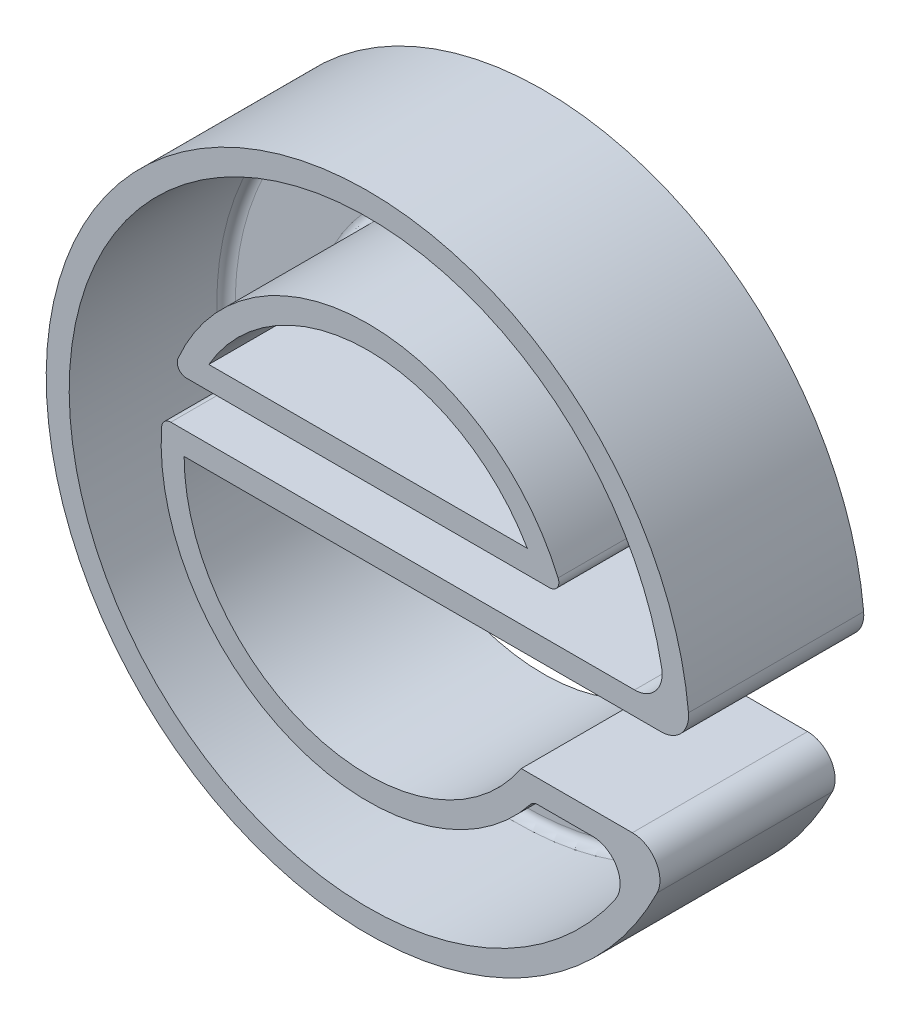
ISO-10303-21;
HEADER;
FILE_DESCRIPTION(('STEP AP214'),'2;1');
FILE_NAME('part.step','',(''),(''),'','','');
FILE_SCHEMA(('AUTOMOTIVE_DESIGN { 1 0 10303 214 1 1 1 1 }'));
ENDSEC;
DATA;
#1=APPLICATION_CONTEXT('core data for automotive mechanical design processes');
#2=APPLICATION_PROTOCOL_DEFINITION('international standard','automotive_design',2000,#1);
#3=PRODUCT_CONTEXT('',#1,'mechanical');
#4=PRODUCT('Part','Part','',(#3));
#5=PRODUCT_RELATED_PRODUCT_CATEGORY('part','',(#4));
#6=PRODUCT_DEFINITION_FORMATION('','',#4);
#7=PRODUCT_DEFINITION_CONTEXT('part definition',#1,'design');
#8=PRODUCT_DEFINITION('design','',#6,#7);
#9=PRODUCT_DEFINITION_SHAPE('','',#8);
#10=(LENGTH_UNIT() NAMED_UNIT(*) SI_UNIT(.MILLI.,.METRE.));
#11=(NAMED_UNIT(*) PLANE_ANGLE_UNIT() SI_UNIT($,.RADIAN.));
#12=(NAMED_UNIT(*) SI_UNIT($,.STERADIAN.) SOLID_ANGLE_UNIT());
#13=UNCERTAINTY_MEASURE_WITH_UNIT(LENGTH_MEASURE(1.E-05),#10,'distance_accuracy_value','');
#14=(GEOMETRIC_REPRESENTATION_CONTEXT(3) GLOBAL_UNCERTAINTY_ASSIGNED_CONTEXT((#13)) GLOBAL_UNIT_ASSIGNED_CONTEXT((#10,
#11,#12)) REPRESENTATION_CONTEXT('',''));
#15=CARTESIAN_POINT('',(0.,0.,0.));
#16=DIRECTION('',(0.,0.,1.));
#17=DIRECTION('',(1.,0.,0.));
#18=AXIS2_PLACEMENT_3D('',#15,#16,#17);
#19=CARTESIAN_POINT('',(0.,0.,19.05));
#20=DIRECTION('',(0.,0.,1.));
#21=DIRECTION('',(1.,0.,0.));
#22=AXIS2_PLACEMENT_3D('',#19,#20,#21);
#23=PLANE('',#22);
#24=DIRECTION('',(1.,0.,0.));
#25=VECTOR('',#24,1.);
#26=CARTESIAN_POINT('',(-17.3205080756888,10.,19.05));
#27=LINE('',#26,#25);
#28=CARTESIAN_POINT('',(-17.3205080756888,10.,19.05));
#29=VERTEX_POINT('',#28);
#30=CARTESIAN_POINT('',(17.3205080756888,10.,19.05));
#31=VERTEX_POINT('',#30);
#32=EDGE_CURVE('E216',#29,#31,#27,.T.);
#33=ORIENTED_EDGE('',*,*,#32,.F.);
#34=CARTESIAN_POINT('',(0.,0.,19.05));
#35=DIRECTION('',(0.,0.,1.));
#36=DIRECTION('',(1.,0.,0.));
#37=AXIS2_PLACEMENT_3D('',#34,#35,#36);
#38=CIRCLE('',#37,20.);
#39=EDGE_CURVE('E227',#31,#29,#38,.T.);
#40=ORIENTED_EDGE('',*,*,#39,.F.);
#41=EDGE_LOOP('',(#33,#40));
#42=FACE_BOUND('',#41,.T.);
#43=DIRECTION('',(1.,0.,0.));
#44=VECTOR('',#43,1.);
#45=CARTESIAN_POINT('',(21.2132034355964,7.50000000000001,19.05));
#46=LINE('',#45,#44);
#47=CARTESIAN_POINT('',(-19.7484176581315,7.5,19.05));
#48=VERTEX_POINT('',#47);
#49=CARTESIAN_POINT('',(19.7484176581315,7.50000000000001,19.05));
#50=VERTEX_POINT('',#49);
#51=EDGE_CURVE('E515',#48,#50,#46,.T.);
#52=ORIENTED_EDGE('',*,*,#51,.T.);
#53=CARTESIAN_POINT('',(19.7484176581315,8.5,19.05));
#54=DIRECTION('',(0.,0.,1.));
#55=DIRECTION('',(1.,0.,0.));
#56=AXIS2_PLACEMENT_3D('',#53,#54,#55);
#57=CIRCLE('',#56,1.);
#58=CARTESIAN_POINT('',(20.6669487119981,8.89534883720931,19.05));
#59=VERTEX_POINT('',#58);
#60=EDGE_CURVE('E422',#50,#59,#57,.T.);
#61=ORIENTED_EDGE('',*,*,#60,.T.);
#62=CARTESIAN_POINT('',(0.,0.,19.05));
#63=DIRECTION('',(0.,0.,1.));
#64=DIRECTION('',(1.,0.,0.));
#65=AXIS2_PLACEMENT_3D('',#62,#63,#64);
#66=CIRCLE('',#65,22.5);
#67=CARTESIAN_POINT('',(-20.6669487119981,8.8953488372093,19.05));
#68=VERTEX_POINT('',#67);
#69=EDGE_CURVE('E449',#59,#68,#66,.T.);
#70=ORIENTED_EDGE('',*,*,#69,.T.);
#71=CARTESIAN_POINT('',(-19.7484176581315,8.5,19.05));
#72=DIRECTION('',(0.,0.,1.));
#73=DIRECTION('',(1.,0.,0.));
#74=AXIS2_PLACEMENT_3D('',#71,#72,#73);
#75=CIRCLE('',#74,1.);
#76=EDGE_CURVE('E419',#68,#48,#75,.T.);
#77=ORIENTED_EDGE('',*,*,#76,.T.);
#78=EDGE_LOOP('',(#52,#61,#70,#77));
#79=FACE_BOUND('',#78,.T.);
#80=ADVANCED_FACE('F45',(#42,#79),#23,.T.);
#81=DIRECTION('',(1.,0.,0.));
#82=VECTOR('',#81,1.);
#83=CARTESIAN_POINT('',(20.,2.5,19.05));
#84=LINE('',#83,#82);
#85=CARTESIAN_POINT('',(-21.4476105895272,2.50000000000001,19.05));
#86=VERTEX_POINT('',#85);
#87=CARTESIAN_POINT('',(28.9827534923789,2.5,19.05));
#88=VERTEX_POINT('',#87);
#89=EDGE_CURVE('E242',#86,#88,#84,.T.);
#90=ORIENTED_EDGE('',*,*,#89,.F.);
#91=CARTESIAN_POINT('',(-21.4476105895272,1.50000000000001,19.05));
#92=DIRECTION('',(0.,0.,1.));
#93=DIRECTION('',(1.,0.,0.));
#94=AXIS2_PLACEMENT_3D('',#91,#92,#93);
#95=CIRCLE('',#94,1.);
#96=CARTESIAN_POINT('',(-22.445173872761,1.56976744186048,19.05));
#97=VERTEX_POINT('',#96);
#98=EDGE_CURVE('E55',#86,#97,#95,.T.);
#99=ORIENTED_EDGE('',*,*,#98,.T.);
#100=CARTESIAN_POINT('',(0.,0.,19.05));
#101=DIRECTION('',(0.,0.,-1.));
#102=DIRECTION('',(1.,0.,0.));
#103=AXIS2_PLACEMENT_3D('',#100,#101,#102);
#104=CIRCLE('',#103,22.5);
#105=CARTESIAN_POINT('',(17.6553113772267,-13.9477589659834,19.05));
#106=VERTEX_POINT('',#105);
#107=EDGE_CURVE('E497',#106,#97,#104,.T.);
#108=ORIENTED_EDGE('',*,*,#107,.F.);
#109=CARTESIAN_POINT('',(18.4399918828812,-14.5676593644715,19.05));
#110=DIRECTION('',(0.,0.,1.));
#111=DIRECTION('',(1.,0.,0.));
#112=AXIS2_PLACEMENT_3D('',#109,#110,#111);
#113=CIRCLE('',#112,1.);
#114=CARTESIAN_POINT('',(18.4399918828812,-13.5676593644715,19.05));
#115=VERTEX_POINT('',#114);
#116=EDGE_CURVE('E11',#106,#115,#113,.F.);
#117=ORIENTED_EDGE('',*,*,#116,.T.);
#118=DIRECTION('',(-1.,0.,0.));
#119=VECTOR('',#118,1.);
#120=CARTESIAN_POINT('',(29.5325010686475,-13.5676593644715,19.05));
#121=LINE('',#120,#119);
#122=CARTESIAN_POINT('',(24.4082499000407,-13.5676593644715,19.05));
#123=VERTEX_POINT('',#122);
#124=EDGE_CURVE('E506',#123,#115,#121,.T.);
#125=ORIENTED_EDGE('',*,*,#124,.F.);
#126=CARTESIAN_POINT('',(24.4082499000407,-16.5676593644715,19.05));
#127=DIRECTION('',(0.,0.,1.));
#128=DIRECTION('',(1.,0.,0.));
#129=AXIS2_PLACEMENT_3D('',#126,#127,#128);
#130=CIRCLE('',#129,3.);
#131=CARTESIAN_POINT('',(26.8904448051296,-18.2525060795025,19.05));
#132=VERTEX_POINT('',#131);
#133=EDGE_CURVE('E330',#123,#132,#130,.F.);
#134=ORIENTED_EDGE('',*,*,#133,.T.);
#135=CARTESIAN_POINT('',(0.,0.,19.05));
#136=DIRECTION('',(0.,0.,1.));
#137=DIRECTION('',(1.,0.,0.));
#138=AXIS2_PLACEMENT_3D('',#135,#136,#137);
#139=CIRCLE('',#138,32.5);
#140=CARTESIAN_POINT('',(31.9301521526208,6.05932203389831,19.05));
#141=VERTEX_POINT('',#140);
#142=EDGE_CURVE('E509',#141,#132,#139,.T.);
#143=ORIENTED_EDGE('',*,*,#142,.F.);
#144=CARTESIAN_POINT('',(28.9827534923789,5.5,19.05));
#145=DIRECTION('',(0.,0.,1.));
#146=DIRECTION('',(1.,0.,0.));
#147=AXIS2_PLACEMENT_3D('',#144,#145,#146);
#148=CIRCLE('',#147,3.);
#149=EDGE_CURVE('E326',#141,#88,#148,.F.);
#150=ORIENTED_EDGE('',*,*,#149,.T.);
#151=EDGE_LOOP('',(#90,#99,#108,#117,#125,#134,#143,#150));
#152=FACE_BOUND('',#151,.T.);
#153=DIRECTION('',(1.,0.,0.));
#154=VECTOR('',#153,1.);
#155=CARTESIAN_POINT('',(-20.,0.,19.05));
#156=LINE('',#155,#154);
#157=CARTESIAN_POINT('',(-20.,0.,19.05));
#158=VERTEX_POINT('',#157);
#159=CARTESIAN_POINT('',(31.859064644148,0.,19.05));
#160=VERTEX_POINT('',#159);
#161=EDGE_CURVE('E250',#158,#160,#156,.T.);
#162=ORIENTED_EDGE('',*,*,#161,.T.);
#163=CARTESIAN_POINT('',(31.859064644148,3.,19.05));
#164=DIRECTION('',(0.,0.,1.));
#165=DIRECTION('',(1.,0.,0.));
#166=AXIS2_PLACEMENT_3D('',#163,#164,#165);
#167=CIRCLE('',#166,3.);
#168=CARTESIAN_POINT('',(34.8458519545369,3.28125,19.05));
#169=VERTEX_POINT('',#168);
#170=EDGE_CURVE('E316',#160,#169,#167,.T.);
#171=ORIENTED_EDGE('',*,*,#170,.T.);
#172=CARTESIAN_POINT('',(0.,0.,19.05));
#173=DIRECTION('',(0.,0.,1.));
#174=DIRECTION('',(1.,0.,0.));
#175=AXIS2_PLACEMENT_3D('',#172,#173,#174);
#176=CIRCLE('',#175,35.);
#177=CARTESIAN_POINT('',(31.4365319807222,-15.3865024298907,19.05));
#178=VERTEX_POINT('',#177);
#179=EDGE_CURVE('E254',#169,#178,#176,.T.);
#180=ORIENTED_EDGE('',*,*,#179,.T.);
#181=CARTESIAN_POINT('',(28.7419720966603,-14.0676593644715,19.05));
#182=DIRECTION('',(0.,0.,1.));
#183=DIRECTION('',(1.,0.,0.));
#184=AXIS2_PLACEMENT_3D('',#181,#182,#183);
#185=CIRCLE('',#184,3.);
#186=CARTESIAN_POINT('',(28.7419720966603,-11.0676593644715,19.05));
#187=VERTEX_POINT('',#186);
#188=EDGE_CURVE('E313',#178,#187,#185,.T.);
#189=ORIENTED_EDGE('',*,*,#188,.T.);
#190=DIRECTION('',(-1.,0.,0.));
#191=VECTOR('',#190,1.);
#192=CARTESIAN_POINT('',(16.6585388372458,-11.0676593644715,19.05));
#193=LINE('',#192,#191);
#194=CARTESIAN_POINT('',(16.6585388372458,-11.0676593644715,19.05));
#195=VERTEX_POINT('',#194);
#196=EDGE_CURVE('E259',#187,#195,#193,.T.);
#197=ORIENTED_EDGE('',*,*,#196,.T.);
#198=CARTESIAN_POINT('',(0.,0.,19.05));
#199=DIRECTION('',(0.,0.,-1.));
#200=DIRECTION('',(1.,0.,0.));
#201=AXIS2_PLACEMENT_3D('',#198,#199,#200);
#202=CIRCLE('',#201,20.);
#203=EDGE_CURVE('E262',#195,#158,#202,.T.);
#204=ORIENTED_EDGE('',*,*,#203,.T.);
#205=EDGE_LOOP('',(#162,#171,#180,#189,#197,#204));
#206=FACE_BOUND('',#205,.T.);
#207=ADVANCED_FACE('F500',(#152,#206),#23,.T.);
#208=CARTESIAN_POINT('',(0.,0.,0.));
#209=DIRECTION('',(0.,0.,1.));
#210=DIRECTION('',(1.,0.,0.));
#211=AXIS2_PLACEMENT_3D('',#208,#209,#210);
#212=PLANE('',#211);
#213=CARTESIAN_POINT('',(0.,0.,0.));
#214=DIRECTION('',(0.,0.,1.));
#215=DIRECTION('',(1.,0.,0.));
#216=AXIS2_PLACEMENT_3D('',#213,#214,#215);
#217=CIRCLE('',#216,35.);
#218=CARTESIAN_POINT('',(34.8458519545369,3.28125,0.));
#219=VERTEX_POINT('',#218);
#220=CARTESIAN_POINT('',(31.4365319807222,-15.3865024298907,0.));
#221=VERTEX_POINT('',#220);
#222=EDGE_CURVE('E269',#219,#221,#217,.T.);
#223=ORIENTED_EDGE('',*,*,#222,.F.);
#224=CARTESIAN_POINT('',(31.859064644148,3.,0.));
#225=DIRECTION('',(0.,0.,1.));
#226=DIRECTION('',(1.,0.,0.));
#227=AXIS2_PLACEMENT_3D('',#224,#225,#226);
#228=CIRCLE('',#227,3.);
#229=CARTESIAN_POINT('',(31.859064644148,0.,0.));
#230=VERTEX_POINT('',#229);
#231=EDGE_CURVE('E307',#219,#230,#228,.F.);
#232=ORIENTED_EDGE('',*,*,#231,.T.);
#233=DIRECTION('',(1.,0.,0.));
#234=VECTOR('',#233,1.);
#235=CARTESIAN_POINT('',(0.,0.,0.));
#236=LINE('',#235,#234);
#237=CARTESIAN_POINT('',(-20.,0.,0.));
#238=VERTEX_POINT('',#237);
#239=EDGE_CURVE('E249',#238,#230,#236,.T.);
#240=ORIENTED_EDGE('',*,*,#239,.F.);
#241=CARTESIAN_POINT('',(0.,0.,0.));
#242=DIRECTION('',(0.,0.,-1.));
#243=DIRECTION('',(1.,0.,0.));
#244=AXIS2_PLACEMENT_3D('',#241,#242,#243);
#245=CIRCLE('',#244,20.);
#246=CARTESIAN_POINT('',(16.6585388372458,-11.0676593644715,0.));
#247=VERTEX_POINT('',#246);
#248=EDGE_CURVE('E255',#247,#238,#245,.T.);
#249=ORIENTED_EDGE('',*,*,#248,.F.);
#250=DIRECTION('',(-1.,0.,0.));
#251=VECTOR('',#250,1.);
#252=CARTESIAN_POINT('',(16.6585388372458,-11.0676593644715,0.));
#253=LINE('',#252,#251);
#254=CARTESIAN_POINT('',(28.7419720966603,-11.0676593644715,0.));
#255=VERTEX_POINT('',#254);
#256=EDGE_CURVE('E273',#255,#247,#253,.T.);
#257=ORIENTED_EDGE('',*,*,#256,.F.);
#258=CARTESIAN_POINT('',(28.7419720966603,-14.0676593644715,0.));
#259=DIRECTION('',(0.,0.,1.));
#260=DIRECTION('',(1.,0.,0.));
#261=AXIS2_PLACEMENT_3D('',#258,#259,#260);
#262=CIRCLE('',#261,3.);
#263=EDGE_CURVE('E304',#255,#221,#262,.F.);
#264=ORIENTED_EDGE('',*,*,#263,.T.);
#265=EDGE_LOOP('',(#223,#232,#240,#249,#257,#264));
#266=FACE_BOUND('',#265,.T.);
#267=CARTESIAN_POINT('',(0.,0.,0.));
#268=DIRECTION('',(0.,0.,1.));
#269=DIRECTION('',(1.,0.,0.));
#270=AXIS2_PLACEMENT_3D('',#267,#268,#269);
#271=CIRCLE('',#270,20.);
#272=CARTESIAN_POINT('',(17.3205080756888,10.,0.));
#273=VERTEX_POINT('',#272);
#274=CARTESIAN_POINT('',(-17.3205080756888,10.,0.));
#275=VERTEX_POINT('',#274);
#276=EDGE_CURVE('E232',#273,#275,#271,.T.);
#277=ORIENTED_EDGE('',*,*,#276,.T.);
#278=DIRECTION('',(1.,0.,0.));
#279=VECTOR('',#278,1.);
#280=CARTESIAN_POINT('',(-17.3205080756888,10.,0.));
#281=LINE('',#280,#279);
#282=EDGE_CURVE('E237',#275,#273,#281,.T.);
#283=ORIENTED_EDGE('',*,*,#282,.T.);
#284=EDGE_LOOP('',(#277,#283));
#285=FACE_BOUND('',#284,.T.);
#286=ADVANCED_FACE('F607',(#266,#285),#212,.F.);
#287=CARTESIAN_POINT('',(0.,0.,19.05));
#288=DIRECTION('',(0.,1.,0.));
#289=DIRECTION('',(0.,0.,1.));
#290=AXIS2_PLACEMENT_3D('',#287,#288,#289);
#291=PLANE('',#290);
#292=ORIENTED_EDGE('',*,*,#239,.T.);
#293=DIRECTION('',(0.,0.,-1.));
#294=VECTOR('',#293,1.);
#295=CARTESIAN_POINT('',(31.859064644148,0.,19.05));
#296=LINE('',#295,#294);
#297=EDGE_CURVE('E310',#230,#160,#296,.F.);
#298=ORIENTED_EDGE('',*,*,#297,.T.);
#299=ORIENTED_EDGE('',*,*,#161,.F.);
#300=DIRECTION('',(0.,0.,-1.));
#301=VECTOR('',#300,1.);
#302=CARTESIAN_POINT('',(-20.,0.,19.05));
#303=LINE('',#302,#301);
#304=EDGE_CURVE('E265',#158,#238,#303,.T.);
#305=ORIENTED_EDGE('',*,*,#304,.T.);
#306=EDGE_LOOP('',(#292,#298,#299,#305));
#307=FACE_BOUND('',#306,.T.);
#308=ADVANCED_FACE('F613',(#307),#291,.F.);
#309=CARTESIAN_POINT('',(0.,0.,19.05));
#310=DIRECTION('',(0.,0.,-1.));
#311=DIRECTION('',(-1.,0.,0.));
#312=AXIS2_PLACEMENT_3D('',#309,#310,#311);
#313=CYLINDRICAL_SURFACE('',#312,35.);
#314=ORIENTED_EDGE('',*,*,#179,.F.);
#315=DIRECTION('',(0.,0.,-1.));
#316=VECTOR('',#315,1.);
#317=CARTESIAN_POINT('',(34.8458519545369,3.28125,19.05));
#318=LINE('',#317,#316);
#319=EDGE_CURVE('E300',#169,#219,#318,.T.);
#320=ORIENTED_EDGE('',*,*,#319,.T.);
#321=ORIENTED_EDGE('',*,*,#222,.T.);
#322=DIRECTION('',(0.,0.,-1.));
#323=VECTOR('',#322,1.);
#324=CARTESIAN_POINT('',(31.4365319807222,-15.3865024298907,19.05));
#325=LINE('',#324,#323);
#326=EDGE_CURVE('E297',#221,#178,#325,.F.);
#327=ORIENTED_EDGE('',*,*,#326,.T.);
#328=EDGE_LOOP('',(#314,#320,#321,#327));
#329=FACE_BOUND('',#328,.T.);
#330=ADVANCED_FACE('F622',(#329),#313,.T.);
#331=CARTESIAN_POINT('',(16.6585388372458,-11.0676593644715,19.05));
#332=DIRECTION('',(0.,-1.,0.));
#333=DIRECTION('',(1.,0.,0.));
#334=AXIS2_PLACEMENT_3D('',#331,#332,#333);
#335=PLANE('',#334);
#336=ORIENTED_EDGE('',*,*,#196,.F.);
#337=DIRECTION('',(0.,0.,-1.));
#338=VECTOR('',#337,1.);
#339=CARTESIAN_POINT('',(28.7419720966603,-11.0676593644715,19.05));
#340=LINE('',#339,#338);
#341=EDGE_CURVE('E319',#187,#255,#340,.T.);
#342=ORIENTED_EDGE('',*,*,#341,.T.);
#343=ORIENTED_EDGE('',*,*,#256,.T.);
#344=DIRECTION('',(0.,0.,-1.));
#345=VECTOR('',#344,1.);
#346=CARTESIAN_POINT('',(16.6585388372458,-11.0676593644715,19.05));
#347=LINE('',#346,#345);
#348=EDGE_CURVE('E282',#195,#247,#347,.T.);
#349=ORIENTED_EDGE('',*,*,#348,.F.);
#350=EDGE_LOOP('',(#336,#342,#343,#349));
#351=FACE_BOUND('',#350,.T.);
#352=ADVANCED_FACE('F618',(#351),#335,.F.);
#353=CARTESIAN_POINT('',(0.,0.,19.05));
#354=DIRECTION('',(0.,0.,-1.));
#355=DIRECTION('',(-1.,0.,0.));
#356=AXIS2_PLACEMENT_3D('',#353,#354,#355);
#357=CYLINDRICAL_SURFACE('',#356,20.);
#358=ORIENTED_EDGE('',*,*,#248,.T.);
#359=ORIENTED_EDGE('',*,*,#304,.F.);
#360=ORIENTED_EDGE('',*,*,#203,.F.);
#361=ORIENTED_EDGE('',*,*,#348,.T.);
#362=EDGE_LOOP('',(#358,#359,#360,#361));
#363=FACE_BOUND('',#362,.T.);
#364=ADVANCED_FACE('F615',(#363),#357,.F.);
#365=CARTESIAN_POINT('',(0.,0.,19.05));
#366=DIRECTION('',(0.,0.,-1.));
#367=DIRECTION('',(-1.,0.,0.));
#368=AXIS2_PLACEMENT_3D('',#365,#366,#367);
#369=CYLINDRICAL_SURFACE('',#368,20.);
#370=ORIENTED_EDGE('',*,*,#276,.F.);
#371=DIRECTION('',(0.,0.,-1.));
#372=VECTOR('',#371,1.);
#373=CARTESIAN_POINT('',(17.3205080756888,10.,19.05));
#374=LINE('',#373,#372);
#375=EDGE_CURVE('E219',#31,#273,#374,.T.);
#376=ORIENTED_EDGE('',*,*,#375,.F.);
#377=ORIENTED_EDGE('',*,*,#39,.T.);
#378=DIRECTION('',(0.,0.,-1.));
#379=VECTOR('',#378,1.);
#380=CARTESIAN_POINT('',(-17.3205080756888,10.,19.05));
#381=LINE('',#380,#379);
#382=EDGE_CURVE('E222',#29,#275,#381,.T.);
#383=ORIENTED_EDGE('',*,*,#382,.T.);
#384=EDGE_LOOP('',(#370,#376,#377,#383));
#385=FACE_BOUND('',#384,.T.);
#386=ADVANCED_FACE('F230',(#385),#369,.F.);
#387=CARTESIAN_POINT('',(-17.3205080756888,10.,19.05));
#388=DIRECTION('',(0.,1.,0.));
#389=DIRECTION('',(0.,0.,1.));
#390=AXIS2_PLACEMENT_3D('',#387,#388,#389);
#391=PLANE('',#390);
#392=ORIENTED_EDGE('',*,*,#282,.F.);
#393=ORIENTED_EDGE('',*,*,#382,.F.);
#394=ORIENTED_EDGE('',*,*,#32,.T.);
#395=ORIENTED_EDGE('',*,*,#375,.T.);
#396=EDGE_LOOP('',(#392,#393,#394,#395));
#397=FACE_BOUND('',#396,.T.);
#398=ADVANCED_FACE('F218',(#397),#391,.T.);
#399=CARTESIAN_POINT('',(0.,0.,2.));
#400=DIRECTION('',(0.,0.,1.));
#401=DIRECTION('',(1.,0.,0.));
#402=AXIS2_PLACEMENT_3D('',#399,#400,#401);
#403=CYLINDRICAL_SURFACE('',#402,32.5);
#404=DIRECTION('',(0.,0.,1.));
#405=VECTOR('',#404,1.);
#406=CARTESIAN_POINT('',(26.8904448051296,-18.2525060795025,2.));
#407=LINE('',#406,#405);
#408=CARTESIAN_POINT('',(26.8904448051296,-18.2525060795025,3.));
#409=VERTEX_POINT('',#408);
#410=EDGE_CURVE('E286',#132,#409,#407,.F.);
#411=ORIENTED_EDGE('',*,*,#410,.T.);
#412=CARTESIAN_POINT('',(0.,0.,3.));
#413=DIRECTION('',(0.,0.,1.));
#414=DIRECTION('',(1.,0.,0.));
#415=AXIS2_PLACEMENT_3D('',#412,#413,#414);
#416=CIRCLE('',#415,32.5);
#417=CARTESIAN_POINT('',(31.9301521526208,6.05932203389831,3.));
#418=VERTEX_POINT('',#417);
#419=EDGE_CURVE('E416',#409,#418,#416,.F.);
#420=ORIENTED_EDGE('',*,*,#419,.T.);
#421=DIRECTION('',(0.,0.,1.));
#422=VECTOR('',#421,1.);
#423=CARTESIAN_POINT('',(31.9301521526208,6.05932203389831,2.));
#424=LINE('',#423,#422);
#425=EDGE_CURVE('E290',#418,#141,#424,.T.);
#426=ORIENTED_EDGE('',*,*,#425,.T.);
#427=ORIENTED_EDGE('',*,*,#142,.T.);
#428=EDGE_LOOP('',(#411,#420,#426,#427));
#429=FACE_BOUND('',#428,.T.);
#430=ADVANCED_FACE('F576',(#429),#403,.F.);
#431=CARTESIAN_POINT('',(20.,2.5,2.));
#432=DIRECTION('',(0.,-1.,0.));
#433=DIRECTION('',(1.,0.,0.));
#434=AXIS2_PLACEMENT_3D('',#431,#432,#433);
#435=PLANE('',#434);
#436=DIRECTION('',(0.,0.,-1.));
#437=VECTOR('',#436,1.);
#438=CARTESIAN_POINT('',(28.9827534923789,2.5,2.));
#439=LINE('',#438,#437);
#440=CARTESIAN_POINT('',(28.9827534923789,2.5,3.));
#441=VERTEX_POINT('',#440);
#442=EDGE_CURVE('E293',#88,#441,#439,.T.);
#443=ORIENTED_EDGE('',*,*,#442,.T.);
#444=DIRECTION('',(1.,0.,0.));
#445=VECTOR('',#444,1.);
#446=CARTESIAN_POINT('',(20.,2.5,3.));
#447=LINE('',#446,#445);
#448=CARTESIAN_POINT('',(-21.4476105895272,2.50000000000001,3.));
#449=VERTEX_POINT('',#448);
#450=EDGE_CURVE('E400',#441,#449,#447,.F.);
#451=ORIENTED_EDGE('',*,*,#450,.T.);
#452=DIRECTION('',(0.,0.,1.));
#453=VECTOR('',#452,1.);
#454=CARTESIAN_POINT('',(-21.4476105895272,2.50000000000001,2.));
#455=LINE('',#454,#453);
#456=EDGE_CURVE('E397',#449,#86,#455,.T.);
#457=ORIENTED_EDGE('',*,*,#456,.T.);
#458=ORIENTED_EDGE('',*,*,#89,.T.);
#459=EDGE_LOOP('',(#443,#451,#457,#458));
#460=FACE_BOUND('',#459,.T.);
#461=ADVANCED_FACE('F861',(#460),#435,.F.);
#462=CARTESIAN_POINT('',(0.,0.,2.));
#463=DIRECTION('',(0.,0.,1.));
#464=DIRECTION('',(1.,0.,0.));
#465=AXIS2_PLACEMENT_3D('',#462,#463,#464);
#466=CYLINDRICAL_SURFACE('',#465,22.5);
#467=ORIENTED_EDGE('',*,*,#107,.T.);
#468=DIRECTION('',(0.,0.,1.));
#469=VECTOR('',#468,1.);
#470=CARTESIAN_POINT('',(-22.445173872761,1.56976744186048,2.));
#471=LINE('',#470,#469);
#472=CARTESIAN_POINT('',(-22.445173872761,1.56976744186048,3.));
#473=VERTEX_POINT('',#472);
#474=EDGE_CURVE('E63',#97,#473,#471,.F.);
#475=ORIENTED_EDGE('',*,*,#474,.T.);
#476=CARTESIAN_POINT('',(0.,0.,3.));
#477=DIRECTION('',(0.,0.,1.));
#478=DIRECTION('',(1.,0.,0.));
#479=AXIS2_PLACEMENT_3D('',#476,#477,#478);
#480=CIRCLE('',#479,22.5);
#481=CARTESIAN_POINT('',(17.6553113772267,-13.9477589659834,3.));
#482=VERTEX_POINT('',#481);
#483=EDGE_CURVE('E67',#473,#482,#480,.T.);
#484=ORIENTED_EDGE('',*,*,#483,.T.);
#485=DIRECTION('',(0.,0.,1.));
#486=VECTOR('',#485,1.);
#487=CARTESIAN_POINT('',(17.6553113772267,-13.9477589659834,2.));
#488=LINE('',#487,#486);
#489=EDGE_CURVE('E409',#482,#106,#488,.T.);
#490=ORIENTED_EDGE('',*,*,#489,.T.);
#491=EDGE_LOOP('',(#467,#475,#484,#490));
#492=FACE_BOUND('',#491,.T.);
#493=ADVANCED_FACE('F496',(#492),#466,.T.);
#494=CARTESIAN_POINT('',(29.5325010686475,-13.5676593644715,2.));
#495=DIRECTION('',(0.,1.,0.));
#496=DIRECTION('',(0.,0.,1.));
#497=AXIS2_PLACEMENT_3D('',#494,#495,#496);
#498=PLANE('',#497);
#499=DIRECTION('',(0.,0.,-1.));
#500=VECTOR('',#499,1.);
#501=CARTESIAN_POINT('',(18.4399918828812,-13.5676593644715,2.));
#502=LINE('',#501,#500);
#503=CARTESIAN_POINT('',(18.4399918828812,-13.5676593644715,3.));
#504=VERTEX_POINT('',#503);
#505=EDGE_CURVE('E403',#115,#504,#502,.T.);
#506=ORIENTED_EDGE('',*,*,#505,.T.);
#507=DIRECTION('',(-1.,0.,0.));
#508=VECTOR('',#507,1.);
#509=CARTESIAN_POINT('',(29.5325010686475,-13.5676593644715,3.));
#510=LINE('',#509,#508);
#511=CARTESIAN_POINT('',(24.4082499000407,-13.5676593644715,3.));
#512=VERTEX_POINT('',#511);
#513=EDGE_CURVE('E406',#504,#512,#510,.F.);
#514=ORIENTED_EDGE('',*,*,#513,.T.);
#515=DIRECTION('',(0.,0.,-1.));
#516=VECTOR('',#515,1.);
#517=CARTESIAN_POINT('',(24.4082499000407,-13.5676593644715,19.05));
#518=LINE('',#517,#516);
#519=EDGE_CURVE('E323',#512,#123,#518,.F.);
#520=ORIENTED_EDGE('',*,*,#519,.T.);
#521=ORIENTED_EDGE('',*,*,#124,.T.);
#522=EDGE_LOOP('',(#506,#514,#520,#521));
#523=FACE_BOUND('',#522,.T.);
#524=ADVANCED_FACE('F559',(#523),#498,.F.);
#525=CARTESIAN_POINT('',(0.,0.,2.));
#526=DIRECTION('',(0.,0.,1.));
#527=DIRECTION('',(1.,0.,0.));
#528=AXIS2_PLACEMENT_3D('',#525,#526,#527);
#529=PLANE('',#528);
#530=CARTESIAN_POINT('',(19.7484176581315,8.5,2.));
#531=DIRECTION('',(0.,0.,1.));
#532=DIRECTION('',(1.,0.,0.));
#533=AXIS2_PLACEMENT_3D('',#530,#531,#532);
#534=CIRCLE('',#533,2.);
#535=CARTESIAN_POINT('',(19.7484176581315,6.50000000000001,2.));
#536=VERTEX_POINT('',#535);
#537=CARTESIAN_POINT('',(21.5854797658647,9.29069767441861,2.));
#538=VERTEX_POINT('',#537);
#539=EDGE_CURVE('E366',#536,#538,#534,.T.);
#540=ORIENTED_EDGE('',*,*,#539,.F.);
#541=DIRECTION('',(1.,0.,0.));
#542=VECTOR('',#541,1.);
#543=CARTESIAN_POINT('',(-21.2132034355964,6.5,2.));
#544=LINE('',#543,#542);
#545=CARTESIAN_POINT('',(-19.7484176581315,6.5,2.));
#546=VERTEX_POINT('',#545);
#547=EDGE_CURVE('E377',#536,#546,#544,.F.);
#548=ORIENTED_EDGE('',*,*,#547,.T.);
#549=CARTESIAN_POINT('',(-19.7484176581315,8.5,2.));
#550=DIRECTION('',(0.,0.,1.));
#551=DIRECTION('',(1.,0.,0.));
#552=AXIS2_PLACEMENT_3D('',#549,#550,#551);
#553=CIRCLE('',#552,2.);
#554=CARTESIAN_POINT('',(-21.5854797658647,9.2906976744186,2.));
#555=VERTEX_POINT('',#554);
#556=EDGE_CURVE('E373',#555,#546,#553,.T.);
#557=ORIENTED_EDGE('',*,*,#556,.F.);
#558=CARTESIAN_POINT('',(0.,0.,2.));
#559=DIRECTION('',(0.,0.,1.));
#560=DIRECTION('',(1.,0.,0.));
#561=AXIS2_PLACEMENT_3D('',#558,#559,#560);
#562=CIRCLE('',#561,23.5);
#563=EDGE_CURVE('E370',#555,#538,#562,.F.);
#564=ORIENTED_EDGE('',*,*,#563,.T.);
#565=EDGE_LOOP('',(#540,#548,#557,#564));
#566=FACE_BOUND('',#565,.T.);
#567=DIRECTION('',(-1.,0.,0.));
#568=VECTOR('',#567,1.);
#569=CARTESIAN_POINT('',(0.,-14.5676593644715,2.));
#570=LINE('',#569,#568);
#571=CARTESIAN_POINT('',(24.4082499000407,-14.5676593644715,2.));
#572=VERTEX_POINT('',#571);
#573=CARTESIAN_POINT('',(18.4399918828812,-14.5676593644715,2.));
#574=VERTEX_POINT('',#573);
#575=EDGE_CURVE('E353',#572,#574,#570,.T.);
#576=ORIENTED_EDGE('',*,*,#575,.T.);
#577=CARTESIAN_POINT('',(0.,0.,2.));
#578=DIRECTION('',(0.,0.,1.));
#579=DIRECTION('',(1.,0.,0.));
#580=AXIS2_PLACEMENT_3D('',#577,#578,#579);
#581=CIRCLE('',#580,23.5);
#582=CARTESIAN_POINT('',(-23.4427371559949,1.63953488372094,2.));
#583=VERTEX_POINT('',#582);
#584=EDGE_CURVE('E363',#574,#583,#581,.F.);
#585=ORIENTED_EDGE('',*,*,#584,.T.);
#586=CARTESIAN_POINT('',(-21.4476105895272,1.50000000000001,2.));
#587=DIRECTION('',(0.,0.,1.));
#588=DIRECTION('',(1.,0.,0.));
#589=AXIS2_PLACEMENT_3D('',#586,#587,#588);
#590=CIRCLE('',#589,2.);
#591=CARTESIAN_POINT('',(-21.4476105895272,3.50000000000001,2.));
#592=VERTEX_POINT('',#591);
#593=EDGE_CURVE('E359',#592,#583,#590,.T.);
#594=ORIENTED_EDGE('',*,*,#593,.F.);
#595=DIRECTION('',(1.,0.,0.));
#596=VECTOR('',#595,1.);
#597=CARTESIAN_POINT('',(0.,3.50000000000001,2.));
#598=LINE('',#597,#596);
#599=CARTESIAN_POINT('',(28.9827534923789,3.5,2.));
#600=VERTEX_POINT('',#599);
#601=EDGE_CURVE('E356',#592,#600,#598,.T.);
#602=ORIENTED_EDGE('',*,*,#601,.T.);
#603=CARTESIAN_POINT('',(28.9827534923789,5.5,2.));
#604=DIRECTION('',(0.,0.,1.));
#605=DIRECTION('',(1.,0.,0.));
#606=AXIS2_PLACEMENT_3D('',#603,#604,#605);
#607=CIRCLE('',#606,2.);
#608=CARTESIAN_POINT('',(30.9476859325402,5.87288135593221,2.));
#609=VERTEX_POINT('',#608);
#610=EDGE_CURVE('E349',#600,#609,#607,.T.);
#611=ORIENTED_EDGE('',*,*,#610,.T.);
#612=CARTESIAN_POINT('',(0.,0.,2.));
#613=DIRECTION('',(0.,0.,1.));
#614=DIRECTION('',(1.,0.,0.));
#615=AXIS2_PLACEMENT_3D('',#612,#613,#614);
#616=CIRCLE('',#615,31.5);
#617=CARTESIAN_POINT('',(26.0630465034333,-17.6908905078255,2.));
#618=VERTEX_POINT('',#617);
#619=EDGE_CURVE('E343',#609,#618,#616,.T.);
#620=ORIENTED_EDGE('',*,*,#619,.T.);
#621=CARTESIAN_POINT('',(24.4082499000407,-16.5676593644715,2.));
#622=DIRECTION('',(0.,0.,1.));
#623=DIRECTION('',(1.,0.,0.));
#624=AXIS2_PLACEMENT_3D('',#621,#622,#623);
#625=CIRCLE('',#624,2.);
#626=EDGE_CURVE('E346',#618,#572,#625,.T.);
#627=ORIENTED_EDGE('',*,*,#626,.T.);
#628=EDGE_LOOP('',(#576,#585,#594,#602,#611,#620,#627));
#629=FACE_BOUND('',#628,.T.);
#630=ADVANCED_FACE('F556',(#566,#629),#529,.T.);
#631=CARTESIAN_POINT('',(0.,0.,2.));
#632=DIRECTION('',(0.,0.,1.));
#633=DIRECTION('',(1.,0.,0.));
#634=AXIS2_PLACEMENT_3D('',#631,#632,#633);
#635=CYLINDRICAL_SURFACE('',#634,22.5);
#636=ORIENTED_EDGE('',*,*,#69,.F.);
#637=DIRECTION('',(0.,0.,1.));
#638=VECTOR('',#637,1.);
#639=CARTESIAN_POINT('',(20.6669487119981,8.8953488372093,2.));
#640=LINE('',#639,#638);
#641=CARTESIAN_POINT('',(20.6669487119981,8.89534883720931,3.));
#642=VERTEX_POINT('',#641);
#643=EDGE_CURVE('E394',#59,#642,#640,.F.);
#644=ORIENTED_EDGE('',*,*,#643,.T.);
#645=CARTESIAN_POINT('',(0.,0.,3.));
#646=DIRECTION('',(0.,0.,1.));
#647=DIRECTION('',(1.,0.,0.));
#648=AXIS2_PLACEMENT_3D('',#645,#646,#647);
#649=CIRCLE('',#648,22.5);
#650=CARTESIAN_POINT('',(-20.6669487119981,8.8953488372093,3.));
#651=VERTEX_POINT('',#650);
#652=EDGE_CURVE('E391',#642,#651,#649,.T.);
#653=ORIENTED_EDGE('',*,*,#652,.T.);
#654=DIRECTION('',(0.,0.,1.));
#655=VECTOR('',#654,1.);
#656=CARTESIAN_POINT('',(-20.6669487119981,8.8953488372093,2.));
#657=LINE('',#656,#655);
#658=EDGE_CURVE('E388',#651,#68,#657,.T.);
#659=ORIENTED_EDGE('',*,*,#658,.T.);
#660=EDGE_LOOP('',(#636,#644,#653,#659));
#661=FACE_BOUND('',#660,.T.);
#662=ADVANCED_FACE('F542',(#661),#635,.T.);
#663=CARTESIAN_POINT('',(21.2132034355964,7.50000000000001,2.));
#664=DIRECTION('',(0.,-1.,0.));
#665=DIRECTION('',(1.,0.,0.));
#666=AXIS2_PLACEMENT_3D('',#663,#664,#665);
#667=PLANE('',#666);
#668=DIRECTION('',(1.,0.,0.));
#669=VECTOR('',#668,1.);
#670=CARTESIAN_POINT('',(21.2132034355964,7.50000000000001,3.));
#671=LINE('',#670,#669);
#672=CARTESIAN_POINT('',(-19.7484176581315,7.5,3.));
#673=VERTEX_POINT('',#672);
#674=CARTESIAN_POINT('',(19.7484176581315,7.50000000000001,3.));
#675=VERTEX_POINT('',#674);
#676=EDGE_CURVE('E336',#673,#675,#671,.T.);
#677=ORIENTED_EDGE('',*,*,#676,.T.);
#678=DIRECTION('',(0.,0.,1.));
#679=VECTOR('',#678,1.);
#680=CARTESIAN_POINT('',(19.7484176581315,7.50000000000001,2.));
#681=LINE('',#680,#679);
#682=EDGE_CURVE('E340',#675,#50,#681,.T.);
#683=ORIENTED_EDGE('',*,*,#682,.T.);
#684=ORIENTED_EDGE('',*,*,#51,.F.);
#685=DIRECTION('',(0.,0.,1.));
#686=VECTOR('',#685,1.);
#687=CARTESIAN_POINT('',(-19.7484176581315,7.5,2.));
#688=LINE('',#687,#686);
#689=EDGE_CURVE('E333',#48,#673,#688,.F.);
#690=ORIENTED_EDGE('',*,*,#689,.T.);
#691=EDGE_LOOP('',(#677,#683,#684,#690));
#692=FACE_BOUND('',#691,.T.);
#693=ADVANCED_FACE('F535',(#692),#667,.T.);
#694=CARTESIAN_POINT('',(28.9827534923789,5.5,2.));
#695=DIRECTION('',(0.,0.,1.));
#696=DIRECTION('',(1.,0.,0.));
#697=AXIS2_PLACEMENT_3D('',#694,#695,#696);
#698=CYLINDRICAL_SURFACE('',#697,3.);
#699=ORIENTED_EDGE('',*,*,#425,.F.);
#700=CARTESIAN_POINT('',(28.9827534923789,5.5,3.));
#701=DIRECTION('',(0.,0.,1.));
#702=DIRECTION('',(1.,0.,0.));
#703=AXIS2_PLACEMENT_3D('',#700,#701,#702);
#704=CIRCLE('',#703,3.);
#705=EDGE_CURVE('E381',#418,#441,#704,.F.);
#706=ORIENTED_EDGE('',*,*,#705,.T.);
#707=ORIENTED_EDGE('',*,*,#442,.F.);
#708=ORIENTED_EDGE('',*,*,#149,.F.);
#709=EDGE_LOOP('',(#699,#706,#707,#708));
#710=FACE_BOUND('',#709,.T.);
#711=ADVANCED_FACE('F584',(#710),#698,.F.);
#712=CARTESIAN_POINT('',(31.859064644148,3.,19.05));
#713=DIRECTION('',(0.,0.,-1.));
#714=DIRECTION('',(-1.,0.,0.));
#715=AXIS2_PLACEMENT_3D('',#712,#713,#714);
#716=CYLINDRICAL_SURFACE('',#715,3.);
#717=ORIENTED_EDGE('',*,*,#170,.F.);
#718=ORIENTED_EDGE('',*,*,#297,.F.);
#719=ORIENTED_EDGE('',*,*,#231,.F.);
#720=ORIENTED_EDGE('',*,*,#319,.F.);
#721=EDGE_LOOP('',(#717,#718,#719,#720));
#722=FACE_BOUND('',#721,.T.);
#723=ADVANCED_FACE('F632',(#722),#716,.T.);
#724=CARTESIAN_POINT('',(28.7419720966603,-14.0676593644715,19.05));
#725=DIRECTION('',(0.,0.,-1.));
#726=DIRECTION('',(-1.,0.,0.));
#727=AXIS2_PLACEMENT_3D('',#724,#725,#726);
#728=CYLINDRICAL_SURFACE('',#727,3.);
#729=ORIENTED_EDGE('',*,*,#188,.F.);
#730=ORIENTED_EDGE('',*,*,#326,.F.);
#731=ORIENTED_EDGE('',*,*,#263,.F.);
#732=ORIENTED_EDGE('',*,*,#341,.F.);
#733=EDGE_LOOP('',(#729,#730,#731,#732));
#734=FACE_BOUND('',#733,.T.);
#735=ADVANCED_FACE('F635',(#734),#728,.T.);
#736=CARTESIAN_POINT('',(24.4082499000407,-16.5676593644715,2.));
#737=DIRECTION('',(0.,0.,1.));
#738=DIRECTION('',(1.,0.,0.));
#739=AXIS2_PLACEMENT_3D('',#736,#737,#738);
#740=CYLINDRICAL_SURFACE('',#739,3.);
#741=ORIENTED_EDGE('',*,*,#519,.F.);
#742=CARTESIAN_POINT('',(24.4082499000407,-16.5676593644715,3.));
#743=DIRECTION('',(0.,0.,1.));
#744=DIRECTION('',(1.,0.,0.));
#745=AXIS2_PLACEMENT_3D('',#742,#743,#744);
#746=CIRCLE('',#745,3.);
#747=EDGE_CURVE('E385',#512,#409,#746,.F.);
#748=ORIENTED_EDGE('',*,*,#747,.T.);
#749=ORIENTED_EDGE('',*,*,#410,.F.);
#750=ORIENTED_EDGE('',*,*,#133,.F.);
#751=EDGE_LOOP('',(#741,#748,#749,#750));
#752=FACE_BOUND('',#751,.T.);
#753=ADVANCED_FACE('F572',(#752),#740,.F.);
#754=CARTESIAN_POINT('',(-19.7484176581315,8.5,2.));
#755=DIRECTION('',(0.,0.,1.));
#756=DIRECTION('',(1.,0.,0.));
#757=AXIS2_PLACEMENT_3D('',#754,#755,#756);
#758=CYLINDRICAL_SURFACE('',#757,1.);
#759=ORIENTED_EDGE('',*,*,#76,.F.);
#760=ORIENTED_EDGE('',*,*,#658,.F.);
#761=CARTESIAN_POINT('',(-19.7484176581315,8.5,3.));
#762=DIRECTION('',(0.,0.,1.));
#763=DIRECTION('',(1.,0.,0.));
#764=AXIS2_PLACEMENT_3D('',#761,#762,#763);
#765=CIRCLE('',#764,1.);
#766=EDGE_CURVE('E441',#673,#651,#765,.F.);
#767=ORIENTED_EDGE('',*,*,#766,.F.);
#768=ORIENTED_EDGE('',*,*,#689,.F.);
#769=EDGE_LOOP('',(#759,#760,#767,#768));
#770=FACE_BOUND('',#769,.T.);
#771=ADVANCED_FACE('F530',(#770),#758,.T.);
#772=CARTESIAN_POINT('',(19.7484176581315,8.5,2.));
#773=DIRECTION('',(0.,0.,1.));
#774=DIRECTION('',(1.,0.,0.));
#775=AXIS2_PLACEMENT_3D('',#772,#773,#774);
#776=CYLINDRICAL_SURFACE('',#775,1.);
#777=ORIENTED_EDGE('',*,*,#60,.F.);
#778=ORIENTED_EDGE('',*,*,#682,.F.);
#779=CARTESIAN_POINT('',(19.7484176581315,8.5,3.));
#780=DIRECTION('',(0.,0.,1.));
#781=DIRECTION('',(1.,0.,0.));
#782=AXIS2_PLACEMENT_3D('',#779,#780,#781);
#783=CIRCLE('',#782,1.);
#784=EDGE_CURVE('E437',#642,#675,#783,.F.);
#785=ORIENTED_EDGE('',*,*,#784,.F.);
#786=ORIENTED_EDGE('',*,*,#643,.F.);
#787=EDGE_LOOP('',(#777,#778,#785,#786));
#788=FACE_BOUND('',#787,.T.);
#789=ADVANCED_FACE('F539',(#788),#776,.T.);
#790=CARTESIAN_POINT('',(0.,0.,3.));
#791=DIRECTION('',(0.,0.,1.));
#792=DIRECTION('',(1.,0.,0.));
#793=AXIS2_PLACEMENT_3D('',#790,#791,#792);
#794=TOROIDAL_SURFACE('',#793,23.5,1.);
#795=CARTESIAN_POINT('',(21.5854797658647,9.29069767441861,3.));
#796=DIRECTION('',(-0.395348837209302,0.918531053866582,0.));
#797=DIRECTION('',(-0.918531053866582,-0.395348837209302,0.));
#798=AXIS2_PLACEMENT_3D('',#795,#796,#797);
#799=CIRCLE('',#798,1.);
#800=EDGE_CURVE('E433',#538,#642,#799,.T.);
#801=ORIENTED_EDGE('',*,*,#800,.F.);
#802=ORIENTED_EDGE('',*,*,#563,.F.);
#803=CARTESIAN_POINT('',(-21.5854797658647,9.2906976744186,3.));
#804=DIRECTION('',(0.395348837209302,0.918531053866582,0.));
#805=DIRECTION('',(-0.918531053866582,0.395348837209302,0.));
#806=AXIS2_PLACEMENT_3D('',#803,#804,#805);
#807=CIRCLE('',#806,1.);
#808=EDGE_CURVE('E445',#651,#555,#807,.T.);
#809=ORIENTED_EDGE('',*,*,#808,.F.);
#810=ORIENTED_EDGE('',*,*,#652,.F.);
#811=EDGE_LOOP('',(#801,#802,#809,#810));
#812=FACE_BOUND('',#811,.T.);
#813=ADVANCED_FACE('F545',(#812),#794,.F.);
#814=CARTESIAN_POINT('',(-19.7484176581315,8.5,3.));
#815=DIRECTION('',(0.,0.,1.));
#816=DIRECTION('',(1.,0.,0.));
#817=AXIS2_PLACEMENT_3D('',#814,#815,#816);
#818=TOROIDAL_SURFACE('',#817,2.,1.);
#819=ORIENTED_EDGE('',*,*,#808,.T.);
#820=ORIENTED_EDGE('',*,*,#556,.T.);
#821=CARTESIAN_POINT('',(-19.7484176581315,6.5,3.));
#822=DIRECTION('',(1.,0.,0.));
#823=DIRECTION('',(0.,0.,-1.));
#824=AXIS2_PLACEMENT_3D('',#821,#822,#823);
#825=CIRCLE('',#824,1.);
#826=EDGE_CURVE('E430',#673,#546,#825,.F.);
#827=ORIENTED_EDGE('',*,*,#826,.F.);
#828=ORIENTED_EDGE('',*,*,#766,.T.);
#829=EDGE_LOOP('',(#819,#820,#827,#828));
#830=FACE_BOUND('',#829,.T.);
#831=ADVANCED_FACE('F548',(#830),#818,.F.);
#832=CARTESIAN_POINT('',(19.7484176581315,8.5,3.));
#833=DIRECTION('',(0.,0.,1.));
#834=DIRECTION('',(1.,0.,0.));
#835=AXIS2_PLACEMENT_3D('',#832,#833,#834);
#836=TOROIDAL_SURFACE('',#835,2.,1.);
#837=ORIENTED_EDGE('',*,*,#800,.T.);
#838=ORIENTED_EDGE('',*,*,#784,.T.);
#839=CARTESIAN_POINT('',(19.7484176581315,6.50000000000001,3.));
#840=DIRECTION('',(-1.,0.,0.));
#841=DIRECTION('',(0.,0.,1.));
#842=AXIS2_PLACEMENT_3D('',#839,#840,#841);
#843=CIRCLE('',#842,1.);
#844=EDGE_CURVE('E427',#536,#675,#843,.F.);
#845=ORIENTED_EDGE('',*,*,#844,.F.);
#846=ORIENTED_EDGE('',*,*,#539,.T.);
#847=EDGE_LOOP('',(#837,#838,#845,#846));
#848=FACE_BOUND('',#847,.T.);
#849=ADVANCED_FACE('F554',(#848),#836,.F.);
#850=CARTESIAN_POINT('',(21.2132034355964,6.50000000000001,3.));
#851=DIRECTION('',(-1.,0.,0.));
#852=DIRECTION('',(0.,-1.,0.));
#853=AXIS2_PLACEMENT_3D('',#850,#851,#852);
#854=CYLINDRICAL_SURFACE('',#853,1.);
#855=ORIENTED_EDGE('',*,*,#826,.T.);
#856=ORIENTED_EDGE('',*,*,#547,.F.);
#857=ORIENTED_EDGE('',*,*,#844,.T.);
#858=ORIENTED_EDGE('',*,*,#676,.F.);
#859=EDGE_LOOP('',(#855,#856,#857,#858));
#860=FACE_BOUND('',#859,.T.);
#861=ADVANCED_FACE('F551',(#860),#854,.F.);
#862=CARTESIAN_POINT('',(18.4399918828812,-14.5676593644715,2.));
#863=DIRECTION('',(0.,0.,1.));
#864=DIRECTION('',(1.,0.,0.));
#865=AXIS2_PLACEMENT_3D('',#862,#863,#864);
#866=CYLINDRICAL_SURFACE('',#865,1.);
#867=CARTESIAN_POINT('',(18.4399918828812,-14.5676593644715,3.));
#868=DIRECTION('',(0.,0.,1.));
#869=DIRECTION('',(1.,0.,0.));
#870=AXIS2_PLACEMENT_3D('',#867,#868,#869);
#871=CIRCLE('',#870,1.);
#872=EDGE_CURVE('E49',#504,#482,#871,.T.);
#873=ORIENTED_EDGE('',*,*,#872,.F.);
#874=ORIENTED_EDGE('',*,*,#505,.F.);
#875=ORIENTED_EDGE('',*,*,#116,.F.);
#876=ORIENTED_EDGE('',*,*,#489,.F.);
#877=EDGE_LOOP('',(#873,#874,#875,#876));
#878=FACE_BOUND('',#877,.T.);
#879=ADVANCED_FACE('F47',(#878),#866,.F.);
#880=CARTESIAN_POINT('',(18.4399918828812,-14.5676593644715,3.));
#881=DIRECTION('',(0.,0.,-1.));
#882=DIRECTION('',(-1.,0.,0.));
#883=AXIS2_PLACEMENT_3D('',#880,#881,#882);
#884=SPHERICAL_SURFACE('',#883,1.);
#885=CARTESIAN_POINT('',(18.4399918828812,-14.5676593644715,3.));
#886=DIRECTION('',(1.,0.,0.));
#887=DIRECTION('',(0.,0.,-1.));
#888=AXIS2_PLACEMENT_3D('',#885,#886,#887);
#889=CIRCLE('',#888,1.);
#890=EDGE_CURVE('E476',#504,#574,#889,.F.);
#891=ORIENTED_EDGE('',*,*,#890,.F.);
#892=ORIENTED_EDGE('',*,*,#872,.T.);
#893=CARTESIAN_POINT('',(18.4399918828812,-14.5676593644715,3.));
#894=DIRECTION('',(-0.619900398488149,-0.78468050565452,0.));
#895=DIRECTION('',(0.78468050565452,-0.619900398488149,0.));
#896=AXIS2_PLACEMENT_3D('',#893,#894,#895);
#897=CIRCLE('',#896,1.);
#898=EDGE_CURVE('E479',#574,#482,#897,.F.);
#899=ORIENTED_EDGE('',*,*,#898,.F.);
#900=EDGE_LOOP('',(#891,#892,#899));
#901=FACE_BOUND('',#900,.T.);
#902=ADVANCED_FACE('F490',(#901),#884,.F.);
#903=CARTESIAN_POINT('',(-21.4476105895272,1.50000000000001,2.));
#904=DIRECTION('',(0.,0.,1.));
#905=DIRECTION('',(1.,0.,0.));
#906=AXIS2_PLACEMENT_3D('',#903,#904,#905);
#907=CYLINDRICAL_SURFACE('',#906,1.);
#908=ORIENTED_EDGE('',*,*,#98,.F.);
#909=ORIENTED_EDGE('',*,*,#456,.F.);
#910=CARTESIAN_POINT('',(-21.4476105895272,1.50000000000001,3.));
#911=DIRECTION('',(0.,0.,1.));
#912=DIRECTION('',(1.,0.,0.));
#913=AXIS2_PLACEMENT_3D('',#910,#911,#912);
#914=CIRCLE('',#913,1.);
#915=EDGE_CURVE('E472',#473,#449,#914,.F.);
#916=ORIENTED_EDGE('',*,*,#915,.F.);
#917=ORIENTED_EDGE('',*,*,#474,.F.);
#918=EDGE_LOOP('',(#908,#909,#916,#917));
#919=FACE_BOUND('',#918,.T.);
#920=ADVANCED_FACE('F588',(#919),#907,.T.);
#921=CARTESIAN_POINT('',(0.,0.,3.));
#922=DIRECTION('',(0.,0.,1.));
#923=DIRECTION('',(1.,0.,0.));
#924=AXIS2_PLACEMENT_3D('',#921,#922,#923);
#925=TOROIDAL_SURFACE('',#924,23.5,1.);
#926=ORIENTED_EDGE('',*,*,#898,.T.);
#927=ORIENTED_EDGE('',*,*,#483,.F.);
#928=CARTESIAN_POINT('',(-23.4427371559949,1.63953488372094,3.));
#929=DIRECTION('',(-0.0697674418604655,-0.997563283233824,0.));
#930=DIRECTION('',(0.997563283233824,-0.0697674418604655,0.));
#931=AXIS2_PLACEMENT_3D('',#928,#929,#930);
#932=CIRCLE('',#931,1.);
#933=EDGE_CURVE('E468',#583,#473,#932,.T.);
#934=ORIENTED_EDGE('',*,*,#933,.F.);
#935=ORIENTED_EDGE('',*,*,#584,.F.);
#936=EDGE_LOOP('',(#926,#927,#934,#935));
#937=FACE_BOUND('',#936,.T.);
#938=ADVANCED_FACE('F593',(#937),#925,.F.);
#939=CARTESIAN_POINT('',(0.,-14.5676593644715,3.));
#940=DIRECTION('',(-1.,0.,0.));
#941=DIRECTION('',(0.,0.,1.));
#942=AXIS2_PLACEMENT_3D('',#939,#940,#941);
#943=CYLINDRICAL_SURFACE('',#942,1.);
#944=ORIENTED_EDGE('',*,*,#890,.T.);
#945=ORIENTED_EDGE('',*,*,#575,.F.);
#946=CARTESIAN_POINT('',(24.4082499000407,-14.5676593644715,3.));
#947=DIRECTION('',(-1.,0.,0.));
#948=DIRECTION('',(0.,0.,1.));
#949=AXIS2_PLACEMENT_3D('',#946,#947,#948);
#950=CIRCLE('',#949,1.);
#951=EDGE_CURVE('E464',#512,#572,#950,.T.);
#952=ORIENTED_EDGE('',*,*,#951,.F.);
#953=ORIENTED_EDGE('',*,*,#513,.F.);
#954=EDGE_LOOP('',(#944,#945,#952,#953));
#955=FACE_BOUND('',#954,.T.);
#956=ADVANCED_FACE('F566',(#955),#943,.F.);
#957=CARTESIAN_POINT('',(-21.4476105895272,1.50000000000001,3.));
#958=DIRECTION('',(0.,0.,1.));
#959=DIRECTION('',(1.,0.,0.));
#960=AXIS2_PLACEMENT_3D('',#957,#958,#959);
#961=TOROIDAL_SURFACE('',#960,2.,1.);
#962=ORIENTED_EDGE('',*,*,#933,.T.);
#963=ORIENTED_EDGE('',*,*,#915,.T.);
#964=CARTESIAN_POINT('',(-21.4476105895272,3.50000000000001,3.));
#965=DIRECTION('',(1.,0.,0.));
#966=DIRECTION('',(0.,0.,-1.));
#967=AXIS2_PLACEMENT_3D('',#964,#965,#966);
#968=CIRCLE('',#967,1.);
#969=EDGE_CURVE('E460',#592,#449,#968,.F.);
#970=ORIENTED_EDGE('',*,*,#969,.F.);
#971=ORIENTED_EDGE('',*,*,#593,.T.);
#972=EDGE_LOOP('',(#962,#963,#970,#971));
#973=FACE_BOUND('',#972,.T.);
#974=ADVANCED_FACE('F592',(#973),#961,.F.);
#975=CARTESIAN_POINT('',(24.4082499000407,-16.5676593644715,3.));
#976=DIRECTION('',(0.,0.,1.));
#977=DIRECTION('',(1.,0.,0.));
#978=AXIS2_PLACEMENT_3D('',#975,#976,#977);
#979=TOROIDAL_SURFACE('',#978,2.,1.);
#980=ORIENTED_EDGE('',*,*,#951,.T.);
#981=ORIENTED_EDGE('',*,*,#626,.F.);
#982=CARTESIAN_POINT('',(26.0630465034333,-17.6908905078255,3.));
#983=DIRECTION('',(0.561615571677002,0.827398301696296,0.));
#984=DIRECTION('',(-0.827398301696296,0.561615571677002,0.));
#985=AXIS2_PLACEMENT_3D('',#982,#983,#984);
#986=CIRCLE('',#985,1.);
#987=EDGE_CURVE('E456',#409,#618,#986,.T.);
#988=ORIENTED_EDGE('',*,*,#987,.F.);
#989=ORIENTED_EDGE('',*,*,#747,.F.);
#990=EDGE_LOOP('',(#980,#981,#988,#989));
#991=FACE_BOUND('',#990,.T.);
#992=ADVANCED_FACE('F665',(#991),#979,.F.);
#993=CARTESIAN_POINT('',(0.,3.50000000000001,3.));
#994=DIRECTION('',(1.,0.,0.));
#995=DIRECTION('',(0.,1.,0.));
#996=AXIS2_PLACEMENT_3D('',#993,#994,#995);
#997=CYLINDRICAL_SURFACE('',#996,1.);
#998=ORIENTED_EDGE('',*,*,#969,.T.);
#999=ORIENTED_EDGE('',*,*,#450,.F.);
#1000=CARTESIAN_POINT('',(28.9827534923789,3.5,3.));
#1001=DIRECTION('',(-1.,0.,0.));
#1002=DIRECTION('',(0.,0.,1.));
#1003=AXIS2_PLACEMENT_3D('',#1000,#1001,#1002);
#1004=CIRCLE('',#1003,1.);
#1005=EDGE_CURVE('E453',#600,#441,#1004,.T.);
#1006=ORIENTED_EDGE('',*,*,#1005,.F.);
#1007=ORIENTED_EDGE('',*,*,#601,.F.);
#1008=EDGE_LOOP('',(#998,#999,#1006,#1007));
#1009=FACE_BOUND('',#1008,.T.);
#1010=ADVANCED_FACE('F661',(#1009),#997,.F.);
#1011=CARTESIAN_POINT('',(0.,0.,3.));
#1012=DIRECTION('',(0.,0.,1.));
#1013=DIRECTION('',(1.,0.,0.));
#1014=AXIS2_PLACEMENT_3D('',#1011,#1012,#1013);
#1015=TOROIDAL_SURFACE('',#1014,31.5,1.);
#1016=ORIENTED_EDGE('',*,*,#987,.T.);
#1017=ORIENTED_EDGE('',*,*,#619,.F.);
#1018=CARTESIAN_POINT('',(30.9476859325402,5.87288135593221,3.));
#1019=DIRECTION('',(-0.186440677966102,0.98246622008064,0.));
#1020=DIRECTION('',(-0.98246622008064,-0.186440677966102,0.));
#1021=AXIS2_PLACEMENT_3D('',#1018,#1019,#1020);
#1022=CIRCLE('',#1021,1.);
#1023=EDGE_CURVE('E450',#418,#609,#1022,.T.);
#1024=ORIENTED_EDGE('',*,*,#1023,.F.);
#1025=ORIENTED_EDGE('',*,*,#419,.F.);
#1026=EDGE_LOOP('',(#1016,#1017,#1024,#1025));
#1027=FACE_BOUND('',#1026,.T.);
#1028=ADVANCED_FACE('F657',(#1027),#1015,.F.);
#1029=CARTESIAN_POINT('',(28.9827534923789,5.5,3.));
#1030=DIRECTION('',(0.,0.,1.));
#1031=DIRECTION('',(1.,0.,0.));
#1032=AXIS2_PLACEMENT_3D('',#1029,#1030,#1031);
#1033=TOROIDAL_SURFACE('',#1032,2.,1.);
#1034=ORIENTED_EDGE('',*,*,#1005,.T.);
#1035=ORIENTED_EDGE('',*,*,#705,.F.);
#1036=ORIENTED_EDGE('',*,*,#1023,.T.);
#1037=ORIENTED_EDGE('',*,*,#610,.F.);
#1038=EDGE_LOOP('',(#1034,#1035,#1036,#1037));
#1039=FACE_BOUND('',#1038,.T.);
#1040=ADVANCED_FACE('F654',(#1039),#1033,.F.);
#1041=CLOSED_SHELL('',(#80,#207,#286,#308,#330,#352,#364,#386,#398,#430,#461,#493,#524,#630,
#662,#693,#711,#723,#735,#753,#771,#789,#813,#831,#849,#861,#879,#902,#920,#938,#956,#974,#992,
#1010,#1028,#1040));
#1042=MANIFOLD_SOLID_BREP('B2',#1041);
#1043=ADVANCED_BREP_SHAPE_REPRESENTATION('',(#18,#1042),#14);
#1044=SHAPE_DEFINITION_REPRESENTATION(#9,#1043);
ENDSEC;
END-ISO-10303-21;
